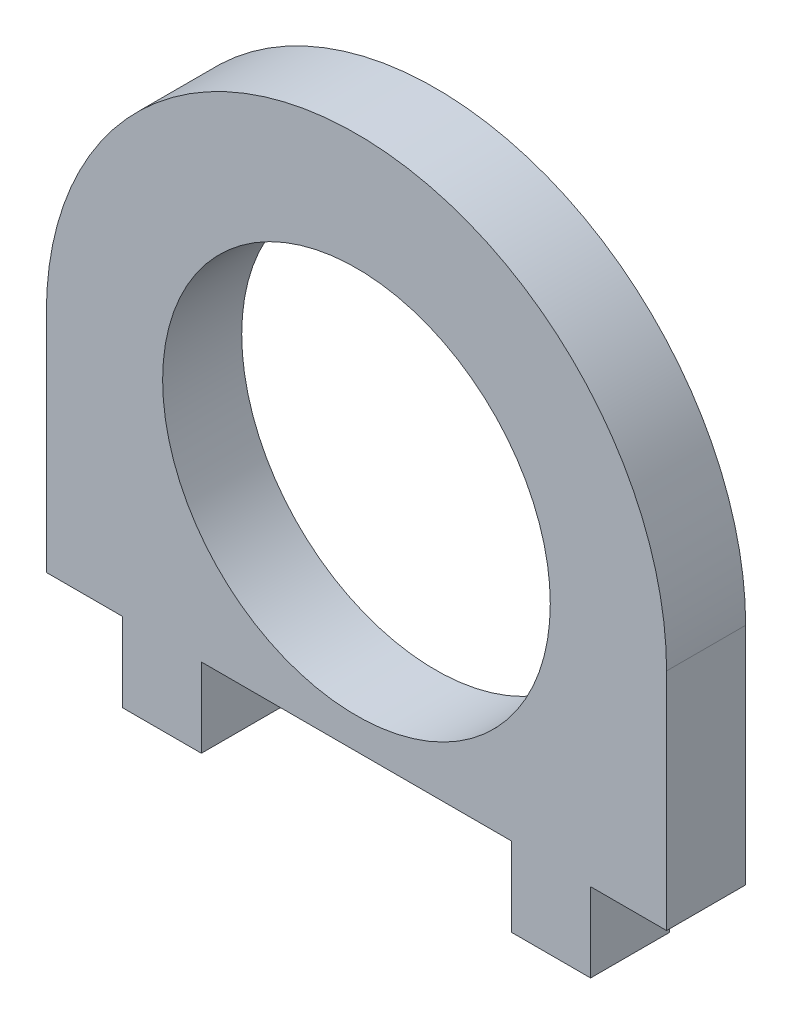
ISO-10303-21;
HEADER;
FILE_DESCRIPTION(('STEP AP214'),'2;1');
FILE_NAME('part.step','',(''),(''),'','','');
FILE_SCHEMA(('AUTOMOTIVE_DESIGN { 1 0 10303 214 1 1 1 1 }'));
ENDSEC;
DATA;
#1=APPLICATION_CONTEXT('core data for automotive mechanical design processes');
#2=APPLICATION_PROTOCOL_DEFINITION('international standard','automotive_design',2000,#1);
#3=PRODUCT_CONTEXT('',#1,'mechanical');
#4=PRODUCT('Part','Part','',(#3));
#5=PRODUCT_RELATED_PRODUCT_CATEGORY('part','',(#4));
#6=PRODUCT_DEFINITION_FORMATION('','',#4);
#7=PRODUCT_DEFINITION_CONTEXT('part definition',#1,'design');
#8=PRODUCT_DEFINITION('design','',#6,#7);
#9=PRODUCT_DEFINITION_SHAPE('','',#8);
#10=(LENGTH_UNIT() NAMED_UNIT(*) SI_UNIT(.MILLI.,.METRE.));
#11=(NAMED_UNIT(*) PLANE_ANGLE_UNIT() SI_UNIT($,.RADIAN.));
#12=(NAMED_UNIT(*) SI_UNIT($,.STERADIAN.) SOLID_ANGLE_UNIT());
#13=UNCERTAINTY_MEASURE_WITH_UNIT(LENGTH_MEASURE(1.E-05),#10,'distance_accuracy_value','');
#14=(GEOMETRIC_REPRESENTATION_CONTEXT(3) GLOBAL_UNCERTAINTY_ASSIGNED_CONTEXT((#13)) GLOBAL_UNIT_ASSIGNED_CONTEXT((#10,
#11,#12)) REPRESENTATION_CONTEXT('',''));
#15=CARTESIAN_POINT('',(0.,0.,0.));
#16=DIRECTION('',(0.,0.,1.));
#17=DIRECTION('',(1.,0.,0.));
#18=AXIS2_PLACEMENT_3D('',#15,#16,#17);
#19=CARTESIAN_POINT('',(-20.,14.5,5.1));
#20=DIRECTION('',(0.,0.,1.));
#21=DIRECTION('',(1.,0.,0.));
#22=AXIS2_PLACEMENT_3D('',#19,#20,#21);
#23=PLANE('',#22);
#24=DIRECTION('',(0.,1.,0.));
#25=VECTOR('',#24,1.);
#26=CARTESIAN_POINT('',(0.,0.,5.1));
#27=LINE('',#26,#25);
#28=CARTESIAN_POINT('',(0.,0.,5.1));
#29=VERTEX_POINT('',#28);
#30=CARTESIAN_POINT('',(0.,14.5,5.1));
#31=VERTEX_POINT('',#30);
#32=EDGE_CURVE('E177',#29,#31,#27,.T.);
#33=ORIENTED_EDGE('',*,*,#32,.T.);
#34=CARTESIAN_POINT('',(-20.,14.5,5.1));
#35=DIRECTION('',(0.,0.,1.));
#36=DIRECTION('',(1.,0.,0.));
#37=AXIS2_PLACEMENT_3D('',#34,#35,#36);
#38=CIRCLE('',#37,20.);
#39=CARTESIAN_POINT('',(-40.,14.5,5.1));
#40=VERTEX_POINT('',#39);
#41=EDGE_CURVE('E105',#31,#40,#38,.T.);
#42=ORIENTED_EDGE('',*,*,#41,.T.);
#43=DIRECTION('',(0.,-1.,0.));
#44=VECTOR('',#43,1.);
#45=CARTESIAN_POINT('',(-40.,0.,5.1));
#46=LINE('',#45,#44);
#47=CARTESIAN_POINT('',(-40.,0.,5.1));
#48=VERTEX_POINT('',#47);
#49=EDGE_CURVE('E204',#40,#48,#46,.T.);
#50=ORIENTED_EDGE('',*,*,#49,.T.);
#51=DIRECTION('',(1.,0.,0.));
#52=VECTOR('',#51,1.);
#53=CARTESIAN_POINT('',(-35.1,0.,5.1));
#54=LINE('',#53,#52);
#55=CARTESIAN_POINT('',(-35.1,0.,5.1));
#56=VERTEX_POINT('',#55);
#57=EDGE_CURVE('E223',#48,#56,#54,.T.);
#58=ORIENTED_EDGE('',*,*,#57,.T.);
#59=DIRECTION('',(0.,-1.,0.));
#60=VECTOR('',#59,1.);
#61=CARTESIAN_POINT('',(-35.1,0.,5.1));
#62=LINE('',#61,#60);
#63=CARTESIAN_POINT('',(-35.1,-5.10000000000001,5.1));
#64=VERTEX_POINT('',#63);
#65=EDGE_CURVE('E220',#56,#64,#62,.T.);
#66=ORIENTED_EDGE('',*,*,#65,.T.);
#67=DIRECTION('',(1.,0.,0.));
#68=VECTOR('',#67,1.);
#69=CARTESIAN_POINT('',(-35.1,-5.10000000000001,5.1));
#70=LINE('',#69,#68);
#71=CARTESIAN_POINT('',(-30.,-5.10000000000001,5.1));
#72=VERTEX_POINT('',#71);
#73=EDGE_CURVE('E222',#64,#72,#70,.T.);
#74=ORIENTED_EDGE('',*,*,#73,.T.);
#75=DIRECTION('',(0.,1.,0.));
#76=VECTOR('',#75,1.);
#77=CARTESIAN_POINT('',(-30.,0.,5.1));
#78=LINE('',#77,#76);
#79=CARTESIAN_POINT('',(-30.,0.,5.1));
#80=VERTEX_POINT('',#79);
#81=EDGE_CURVE('E225',#72,#80,#78,.T.);
#82=ORIENTED_EDGE('',*,*,#81,.T.);
#83=DIRECTION('',(1.,0.,0.));
#84=VECTOR('',#83,1.);
#85=CARTESIAN_POINT('',(-10.,0.,5.1));
#86=LINE('',#85,#84);
#87=CARTESIAN_POINT('',(-10.,0.,5.1));
#88=VERTEX_POINT('',#87);
#89=EDGE_CURVE('E231',#80,#88,#86,.T.);
#90=ORIENTED_EDGE('',*,*,#89,.T.);
#91=DIRECTION('',(0.,-1.,0.));
#92=VECTOR('',#91,1.);
#93=CARTESIAN_POINT('',(-10.,0.,5.1));
#94=LINE('',#93,#92);
#95=CARTESIAN_POINT('',(-10.,-5.1,5.1));
#96=VERTEX_POINT('',#95);
#97=EDGE_CURVE('E136',#88,#96,#94,.T.);
#98=ORIENTED_EDGE('',*,*,#97,.T.);
#99=DIRECTION('',(1.,0.,0.));
#100=VECTOR('',#99,1.);
#101=CARTESIAN_POINT('',(-10.,-5.1,5.1));
#102=LINE('',#101,#100);
#103=CARTESIAN_POINT('',(-4.9,-5.1,5.1));
#104=VERTEX_POINT('',#103);
#105=EDGE_CURVE('E130',#96,#104,#102,.T.);
#106=ORIENTED_EDGE('',*,*,#105,.T.);
#107=DIRECTION('',(0.,1.,0.));
#108=VECTOR('',#107,1.);
#109=CARTESIAN_POINT('',(-4.9,0.,5.1));
#110=LINE('',#109,#108);
#111=CARTESIAN_POINT('',(-4.9,0.,5.1));
#112=VERTEX_POINT('',#111);
#113=EDGE_CURVE('E134',#104,#112,#110,.T.);
#114=ORIENTED_EDGE('',*,*,#113,.T.);
#115=DIRECTION('',(1.,0.,0.));
#116=VECTOR('',#115,1.);
#117=CARTESIAN_POINT('',(0.,0.,5.1));
#118=LINE('',#117,#116);
#119=EDGE_CURVE('E50',#112,#29,#118,.T.);
#120=ORIENTED_EDGE('',*,*,#119,.T.);
#121=EDGE_LOOP('',(#33,#42,#50,#58,#66,#74,#82,#90,#98,#106,#114,#120));
#122=FACE_BOUND('',#121,.T.);
#123=CARTESIAN_POINT('',(-20.,14.5,5.1));
#124=DIRECTION('',(0.,0.,1.));
#125=DIRECTION('',(1.,0.,0.));
#126=AXIS2_PLACEMENT_3D('',#123,#124,#125);
#127=CIRCLE('',#126,12.5);
#128=CARTESIAN_POINT('',(-7.5,14.5,5.1));
#129=VERTEX_POINT('',#128);
#130=EDGE_CURVE('E158',#129,#129,#127,.T.);
#131=ORIENTED_EDGE('',*,*,#130,.F.);
#132=EDGE_LOOP('',(#131));
#133=FACE_BOUND('',#132,.T.);
#134=ADVANCED_FACE('F33',(#122,#133),#23,.T.);
#135=CARTESIAN_POINT('',(-20.,14.5,0.));
#136=DIRECTION('',(0.,0.,1.));
#137=DIRECTION('',(1.,0.,0.));
#138=AXIS2_PLACEMENT_3D('',#135,#136,#137);
#139=PLANE('',#138);
#140=DIRECTION('',(0.,1.,0.));
#141=VECTOR('',#140,1.);
#142=CARTESIAN_POINT('',(0.,0.,0.));
#143=LINE('',#142,#141);
#144=CARTESIAN_POINT('',(0.,0.,0.));
#145=VERTEX_POINT('',#144);
#146=CARTESIAN_POINT('',(0.,14.5,0.));
#147=VERTEX_POINT('',#146);
#148=EDGE_CURVE('E154',#145,#147,#143,.T.);
#149=ORIENTED_EDGE('',*,*,#148,.F.);
#150=DIRECTION('',(1.,0.,0.));
#151=VECTOR('',#150,1.);
#152=CARTESIAN_POINT('',(0.,0.,0.));
#153=LINE('',#152,#151);
#154=CARTESIAN_POINT('',(-4.9,0.,0.));
#155=VERTEX_POINT('',#154);
#156=EDGE_CURVE('E97',#155,#145,#153,.T.);
#157=ORIENTED_EDGE('',*,*,#156,.F.);
#158=DIRECTION('',(0.,1.,0.));
#159=VECTOR('',#158,1.);
#160=CARTESIAN_POINT('',(-4.9,0.,0.));
#161=LINE('',#160,#159);
#162=CARTESIAN_POINT('',(-4.9,-5.1,0.));
#163=VERTEX_POINT('',#162);
#164=EDGE_CURVE('E91',#163,#155,#161,.T.);
#165=ORIENTED_EDGE('',*,*,#164,.F.);
#166=DIRECTION('',(1.,0.,0.));
#167=VECTOR('',#166,1.);
#168=CARTESIAN_POINT('',(-10.,-5.1,0.));
#169=LINE('',#168,#167);
#170=CARTESIAN_POINT('',(-10.,-5.1,0.));
#171=VERTEX_POINT('',#170);
#172=EDGE_CURVE('E144',#171,#163,#169,.T.);
#173=ORIENTED_EDGE('',*,*,#172,.F.);
#174=DIRECTION('',(0.,-1.,0.));
#175=VECTOR('',#174,1.);
#176=CARTESIAN_POINT('',(-10.,0.,0.));
#177=LINE('',#176,#175);
#178=CARTESIAN_POINT('',(-10.,0.,0.));
#179=VERTEX_POINT('',#178);
#180=EDGE_CURVE('E172',#179,#171,#177,.T.);
#181=ORIENTED_EDGE('',*,*,#180,.F.);
#182=DIRECTION('',(1.,0.,0.));
#183=VECTOR('',#182,1.);
#184=CARTESIAN_POINT('',(-10.,0.,0.));
#185=LINE('',#184,#183);
#186=CARTESIAN_POINT('',(-30.,0.,0.));
#187=VERTEX_POINT('',#186);
#188=EDGE_CURVE('E170',#187,#179,#185,.T.);
#189=ORIENTED_EDGE('',*,*,#188,.F.);
#190=DIRECTION('',(0.,1.,0.));
#191=VECTOR('',#190,1.);
#192=CARTESIAN_POINT('',(-30.,0.,0.));
#193=LINE('',#192,#191);
#194=CARTESIAN_POINT('',(-30.,-5.10000000000001,0.));
#195=VERTEX_POINT('',#194);
#196=EDGE_CURVE('E168',#195,#187,#193,.T.);
#197=ORIENTED_EDGE('',*,*,#196,.F.);
#198=DIRECTION('',(1.,0.,0.));
#199=VECTOR('',#198,1.);
#200=CARTESIAN_POINT('',(-35.1,-5.10000000000001,0.));
#201=LINE('',#200,#199);
#202=CARTESIAN_POINT('',(-35.1,-5.10000000000001,0.));
#203=VERTEX_POINT('',#202);
#204=EDGE_CURVE('E166',#203,#195,#201,.T.);
#205=ORIENTED_EDGE('',*,*,#204,.F.);
#206=DIRECTION('',(0.,-1.,0.));
#207=VECTOR('',#206,1.);
#208=CARTESIAN_POINT('',(-35.1,0.,0.));
#209=LINE('',#208,#207);
#210=CARTESIAN_POINT('',(-35.1,0.,0.));
#211=VERTEX_POINT('',#210);
#212=EDGE_CURVE('E164',#211,#203,#209,.T.);
#213=ORIENTED_EDGE('',*,*,#212,.F.);
#214=DIRECTION('',(1.,0.,0.));
#215=VECTOR('',#214,1.);
#216=CARTESIAN_POINT('',(-35.1,0.,0.));
#217=LINE('',#216,#215);
#218=CARTESIAN_POINT('',(-40.,0.,0.));
#219=VERTEX_POINT('',#218);
#220=EDGE_CURVE('E162',#219,#211,#217,.T.);
#221=ORIENTED_EDGE('',*,*,#220,.F.);
#222=DIRECTION('',(0.,-1.,0.));
#223=VECTOR('',#222,1.);
#224=CARTESIAN_POINT('',(-40.,0.,0.));
#225=LINE('',#224,#223);
#226=CARTESIAN_POINT('',(-40.,14.5,0.));
#227=VERTEX_POINT('',#226);
#228=EDGE_CURVE('E160',#227,#219,#225,.T.);
#229=ORIENTED_EDGE('',*,*,#228,.F.);
#230=CARTESIAN_POINT('',(-20.,14.5,0.));
#231=DIRECTION('',(0.,0.,1.));
#232=DIRECTION('',(1.,0.,0.));
#233=AXIS2_PLACEMENT_3D('',#230,#231,#232);
#234=CIRCLE('',#233,20.);
#235=EDGE_CURVE('E157',#147,#227,#234,.T.);
#236=ORIENTED_EDGE('',*,*,#235,.F.);
#237=EDGE_LOOP('',(#149,#157,#165,#173,#181,#189,#197,#205,#213,#221,#229,#236));
#238=FACE_BOUND('',#237,.T.);
#239=CARTESIAN_POINT('',(-20.,14.5,0.));
#240=DIRECTION('',(0.,0.,1.));
#241=DIRECTION('',(1.,0.,0.));
#242=AXIS2_PLACEMENT_3D('',#239,#240,#241);
#243=CIRCLE('',#242,12.5);
#244=CARTESIAN_POINT('',(-7.5,14.5,0.));
#245=VERTEX_POINT('',#244);
#246=EDGE_CURVE('E378',#245,#245,#243,.T.);
#247=ORIENTED_EDGE('',*,*,#246,.T.);
#248=EDGE_LOOP('',(#247));
#249=FACE_BOUND('',#248,.T.);
#250=ADVANCED_FACE('F208',(#238,#249),#139,.F.);
#251=CARTESIAN_POINT('',(0.,0.,5.1));
#252=DIRECTION('',(-1.,0.,0.));
#253=DIRECTION('',(0.,-1.,0.));
#254=AXIS2_PLACEMENT_3D('',#251,#252,#253);
#255=PLANE('',#254);
#256=ORIENTED_EDGE('',*,*,#148,.T.);
#257=DIRECTION('',(0.,0.,-1.));
#258=VECTOR('',#257,1.);
#259=CARTESIAN_POINT('',(0.,14.5,5.1));
#260=LINE('',#259,#258);
#261=EDGE_CURVE('E11',#31,#147,#260,.T.);
#262=ORIENTED_EDGE('',*,*,#261,.F.);
#263=ORIENTED_EDGE('',*,*,#32,.F.);
#264=DIRECTION('',(0.,0.,-1.));
#265=VECTOR('',#264,1.);
#266=CARTESIAN_POINT('',(0.,0.,5.1));
#267=LINE('',#266,#265);
#268=EDGE_CURVE('E150',#29,#145,#267,.T.);
#269=ORIENTED_EDGE('',*,*,#268,.T.);
#270=EDGE_LOOP('',(#256,#262,#263,#269));
#271=FACE_BOUND('',#270,.T.);
#272=ADVANCED_FACE('F35',(#271),#255,.F.);
#273=CARTESIAN_POINT('',(-20.,14.5,5.1));
#274=DIRECTION('',(0.,0.,-1.));
#275=DIRECTION('',(-1.,0.,0.));
#276=AXIS2_PLACEMENT_3D('',#273,#274,#275);
#277=CYLINDRICAL_SURFACE('',#276,20.);
#278=ORIENTED_EDGE('',*,*,#235,.T.);
#279=DIRECTION('',(0.,0.,-1.));
#280=VECTOR('',#279,1.);
#281=CARTESIAN_POINT('',(-40.,14.5,5.1));
#282=LINE('',#281,#280);
#283=EDGE_CURVE('E42',#40,#227,#282,.T.);
#284=ORIENTED_EDGE('',*,*,#283,.F.);
#285=ORIENTED_EDGE('',*,*,#41,.F.);
#286=ORIENTED_EDGE('',*,*,#261,.T.);
#287=EDGE_LOOP('',(#278,#284,#285,#286));
#288=FACE_BOUND('',#287,.T.);
#289=ADVANCED_FACE('F265',(#288),#277,.T.);
#290=CARTESIAN_POINT('',(-40.,0.,5.1));
#291=DIRECTION('',(1.,0.,0.));
#292=DIRECTION('',(0.,0.,-1.));
#293=AXIS2_PLACEMENT_3D('',#290,#291,#292);
#294=PLANE('',#293);
#295=ORIENTED_EDGE('',*,*,#228,.T.);
#296=DIRECTION('',(0.,0.,-1.));
#297=VECTOR('',#296,1.);
#298=CARTESIAN_POINT('',(-40.,0.,5.1));
#299=LINE('',#298,#297);
#300=EDGE_CURVE('E196',#48,#219,#299,.T.);
#301=ORIENTED_EDGE('',*,*,#300,.F.);
#302=ORIENTED_EDGE('',*,*,#49,.F.);
#303=ORIENTED_EDGE('',*,*,#283,.T.);
#304=EDGE_LOOP('',(#295,#301,#302,#303));
#305=FACE_BOUND('',#304,.T.);
#306=ADVANCED_FACE('F202',(#305),#294,.F.);
#307=CARTESIAN_POINT('',(-35.1,0.,5.1));
#308=DIRECTION('',(0.,1.,0.));
#309=DIRECTION('',(-1.,0.,0.));
#310=AXIS2_PLACEMENT_3D('',#307,#308,#309);
#311=PLANE('',#310);
#312=ORIENTED_EDGE('',*,*,#220,.T.);
#313=DIRECTION('',(0.,0.,-1.));
#314=VECTOR('',#313,1.);
#315=CARTESIAN_POINT('',(-35.1,0.,5.1));
#316=LINE('',#315,#314);
#317=EDGE_CURVE('E193',#56,#211,#316,.T.);
#318=ORIENTED_EDGE('',*,*,#317,.F.);
#319=ORIENTED_EDGE('',*,*,#57,.F.);
#320=ORIENTED_EDGE('',*,*,#300,.T.);
#321=EDGE_LOOP('',(#312,#318,#319,#320));
#322=FACE_BOUND('',#321,.T.);
#323=ADVANCED_FACE('F214',(#322),#311,.F.);
#324=CARTESIAN_POINT('',(-35.1,0.,5.1));
#325=DIRECTION('',(1.,0.,0.));
#326=DIRECTION('',(0.,0.,-1.));
#327=AXIS2_PLACEMENT_3D('',#324,#325,#326);
#328=PLANE('',#327);
#329=ORIENTED_EDGE('',*,*,#212,.T.);
#330=DIRECTION('',(0.,0.,-1.));
#331=VECTOR('',#330,1.);
#332=CARTESIAN_POINT('',(-35.1,-5.10000000000001,5.1));
#333=LINE('',#332,#331);
#334=EDGE_CURVE('E190',#64,#203,#333,.T.);
#335=ORIENTED_EDGE('',*,*,#334,.F.);
#336=ORIENTED_EDGE('',*,*,#65,.F.);
#337=ORIENTED_EDGE('',*,*,#317,.T.);
#338=EDGE_LOOP('',(#329,#335,#336,#337));
#339=FACE_BOUND('',#338,.T.);
#340=ADVANCED_FACE('F218',(#339),#328,.F.);
#341=CARTESIAN_POINT('',(-35.1,-5.10000000000001,5.1));
#342=DIRECTION('',(0.,1.,0.));
#343=DIRECTION('',(0.,0.,1.));
#344=AXIS2_PLACEMENT_3D('',#341,#342,#343);
#345=PLANE('',#344);
#346=ORIENTED_EDGE('',*,*,#204,.T.);
#347=DIRECTION('',(0.,0.,-1.));
#348=VECTOR('',#347,1.);
#349=CARTESIAN_POINT('',(-30.,-5.10000000000001,5.1));
#350=LINE('',#349,#348);
#351=EDGE_CURVE('E187',#72,#195,#350,.T.);
#352=ORIENTED_EDGE('',*,*,#351,.F.);
#353=ORIENTED_EDGE('',*,*,#73,.F.);
#354=ORIENTED_EDGE('',*,*,#334,.T.);
#355=EDGE_LOOP('',(#346,#352,#353,#354));
#356=FACE_BOUND('',#355,.T.);
#357=ADVANCED_FACE('F278',(#356),#345,.F.);
#358=CARTESIAN_POINT('',(-30.,0.,5.1));
#359=DIRECTION('',(-1.,0.,0.));
#360=DIRECTION('',(0.,0.,1.));
#361=AXIS2_PLACEMENT_3D('',#358,#359,#360);
#362=PLANE('',#361);
#363=ORIENTED_EDGE('',*,*,#196,.T.);
#364=DIRECTION('',(0.,0.,-1.));
#365=VECTOR('',#364,1.);
#366=CARTESIAN_POINT('',(-30.,0.,5.1));
#367=LINE('',#366,#365);
#368=EDGE_CURVE('E184',#80,#187,#367,.T.);
#369=ORIENTED_EDGE('',*,*,#368,.F.);
#370=ORIENTED_EDGE('',*,*,#81,.F.);
#371=ORIENTED_EDGE('',*,*,#351,.T.);
#372=EDGE_LOOP('',(#363,#369,#370,#371));
#373=FACE_BOUND('',#372,.T.);
#374=ADVANCED_FACE('F281',(#373),#362,.F.);
#375=CARTESIAN_POINT('',(-10.,0.,5.1));
#376=DIRECTION('',(0.,1.,0.));
#377=DIRECTION('',(-1.,0.,0.));
#378=AXIS2_PLACEMENT_3D('',#375,#376,#377);
#379=PLANE('',#378);
#380=ORIENTED_EDGE('',*,*,#188,.T.);
#381=DIRECTION('',(0.,0.,-1.));
#382=VECTOR('',#381,1.);
#383=CARTESIAN_POINT('',(-10.,0.,5.1));
#384=LINE('',#383,#382);
#385=EDGE_CURVE('E181',#88,#179,#384,.T.);
#386=ORIENTED_EDGE('',*,*,#385,.F.);
#387=ORIENTED_EDGE('',*,*,#89,.F.);
#388=ORIENTED_EDGE('',*,*,#368,.T.);
#389=EDGE_LOOP('',(#380,#386,#387,#388));
#390=FACE_BOUND('',#389,.T.);
#391=ADVANCED_FACE('F237',(#390),#379,.F.);
#392=CARTESIAN_POINT('',(-10.,0.,5.1));
#393=DIRECTION('',(1.,0.,0.));
#394=DIRECTION('',(0.,1.,0.));
#395=AXIS2_PLACEMENT_3D('',#392,#393,#394);
#396=PLANE('',#395);
#397=ORIENTED_EDGE('',*,*,#180,.T.);
#398=DIRECTION('',(0.,0.,-1.));
#399=VECTOR('',#398,1.);
#400=CARTESIAN_POINT('',(-10.,-5.1,5.1));
#401=LINE('',#400,#399);
#402=EDGE_CURVE('E145',#96,#171,#401,.T.);
#403=ORIENTED_EDGE('',*,*,#402,.F.);
#404=ORIENTED_EDGE('',*,*,#97,.F.);
#405=ORIENTED_EDGE('',*,*,#385,.T.);
#406=EDGE_LOOP('',(#397,#403,#404,#405));
#407=FACE_BOUND('',#406,.T.);
#408=ADVANCED_FACE('F241',(#407),#396,.F.);
#409=CARTESIAN_POINT('',(-10.,-5.1,5.1));
#410=DIRECTION('',(0.,1.,0.));
#411=DIRECTION('',(0.,0.,1.));
#412=AXIS2_PLACEMENT_3D('',#409,#410,#411);
#413=PLANE('',#412);
#414=ORIENTED_EDGE('',*,*,#172,.T.);
#415=DIRECTION('',(0.,0.,-1.));
#416=VECTOR('',#415,1.);
#417=CARTESIAN_POINT('',(-4.9,-5.1,5.1));
#418=LINE('',#417,#416);
#419=EDGE_CURVE('E141',#104,#163,#418,.T.);
#420=ORIENTED_EDGE('',*,*,#419,.F.);
#421=ORIENTED_EDGE('',*,*,#105,.F.);
#422=ORIENTED_EDGE('',*,*,#402,.T.);
#423=EDGE_LOOP('',(#414,#420,#421,#422));
#424=FACE_BOUND('',#423,.T.);
#425=ADVANCED_FACE('F142',(#424),#413,.F.);
#426=CARTESIAN_POINT('',(-4.9,0.,5.1));
#427=DIRECTION('',(-1.,0.,0.));
#428=DIRECTION('',(0.,0.,1.));
#429=AXIS2_PLACEMENT_3D('',#426,#427,#428);
#430=PLANE('',#429);
#431=ORIENTED_EDGE('',*,*,#164,.T.);
#432=DIRECTION('',(0.,0.,-1.));
#433=VECTOR('',#432,1.);
#434=CARTESIAN_POINT('',(-4.9,0.,5.1));
#435=LINE('',#434,#433);
#436=EDGE_CURVE('E146',#112,#155,#435,.T.);
#437=ORIENTED_EDGE('',*,*,#436,.F.);
#438=ORIENTED_EDGE('',*,*,#113,.F.);
#439=ORIENTED_EDGE('',*,*,#419,.T.);
#440=EDGE_LOOP('',(#431,#437,#438,#439));
#441=FACE_BOUND('',#440,.T.);
#442=ADVANCED_FACE('F148',(#441),#430,.F.);
#443=CARTESIAN_POINT('',(0.,0.,5.1));
#444=DIRECTION('',(0.,1.,0.));
#445=DIRECTION('',(-1.,0.,0.));
#446=AXIS2_PLACEMENT_3D('',#443,#444,#445);
#447=PLANE('',#446);
#448=ORIENTED_EDGE('',*,*,#156,.T.);
#449=ORIENTED_EDGE('',*,*,#268,.F.);
#450=ORIENTED_EDGE('',*,*,#119,.F.);
#451=ORIENTED_EDGE('',*,*,#436,.T.);
#452=EDGE_LOOP('',(#448,#449,#450,#451));
#453=FACE_BOUND('',#452,.T.);
#454=ADVANCED_FACE('F245',(#453),#447,.F.);
#455=CARTESIAN_POINT('',(-20.,14.5,5.1));
#456=DIRECTION('',(0.,0.,-1.));
#457=DIRECTION('',(-1.,0.,0.));
#458=AXIS2_PLACEMENT_3D('',#455,#456,#457);
#459=CYLINDRICAL_SURFACE('',#458,12.5);
#460=ORIENTED_EDGE('',*,*,#130,.T.);
#461=EDGE_LOOP('',(#460));
#462=FACE_BOUND('',#461,.T.);
#463=ORIENTED_EDGE('',*,*,#246,.F.);
#464=EDGE_LOOP('',(#463));
#465=FACE_BOUND('',#464,.T.);
#466=ADVANCED_FACE('F247',(#462,#465),#459,.F.);
#467=CLOSED_SHELL('',(#134,#250,#272,#289,#306,#323,#340,#357,#374,#391,#408,#425,#442,#454,#466));
#468=MANIFOLD_SOLID_BREP('B2',#467);
#469=ADVANCED_BREP_SHAPE_REPRESENTATION('',(#18,#468),#14);
#470=SHAPE_DEFINITION_REPRESENTATION(#9,#469);
ENDSEC;
END-ISO-10303-21;
